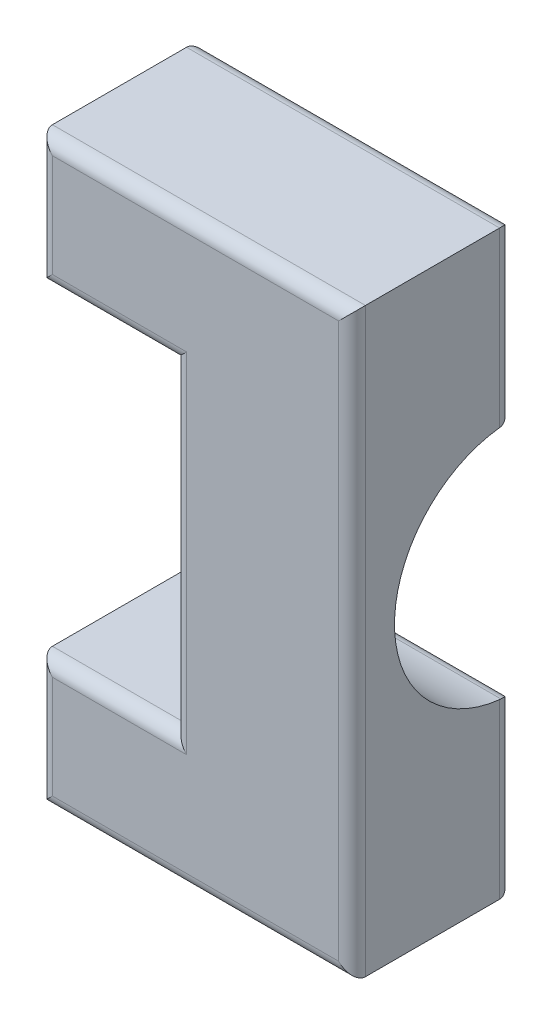
ISO-10303-21;
HEADER;
FILE_DESCRIPTION(('STEP AP214'),'2;1');
FILE_NAME('part.step','',(''),(''),'','','');
FILE_SCHEMA(('AUTOMOTIVE_DESIGN { 1 0 10303 214 1 1 1 1 }'));
ENDSEC;
DATA;
#1=APPLICATION_CONTEXT('core data for automotive mechanical design processes');
#2=APPLICATION_PROTOCOL_DEFINITION('international standard','automotive_design',2000,#1);
#3=PRODUCT_CONTEXT('',#1,'mechanical');
#4=PRODUCT('Part','Part','',(#3));
#5=PRODUCT_RELATED_PRODUCT_CATEGORY('part','',(#4));
#6=PRODUCT_DEFINITION_FORMATION('','',#4);
#7=PRODUCT_DEFINITION_CONTEXT('part definition',#1,'design');
#8=PRODUCT_DEFINITION('design','',#6,#7);
#9=PRODUCT_DEFINITION_SHAPE('','',#8);
#10=(LENGTH_UNIT() NAMED_UNIT(*) SI_UNIT(.MILLI.,.METRE.));
#11=(NAMED_UNIT(*) PLANE_ANGLE_UNIT() SI_UNIT($,.RADIAN.));
#12=(NAMED_UNIT(*) SI_UNIT($,.STERADIAN.) SOLID_ANGLE_UNIT());
#13=UNCERTAINTY_MEASURE_WITH_UNIT(LENGTH_MEASURE(1.E-05),#10,'distance_accuracy_value','');
#14=(GEOMETRIC_REPRESENTATION_CONTEXT(3) GLOBAL_UNCERTAINTY_ASSIGNED_CONTEXT((#13)) GLOBAL_UNIT_ASSIGNED_CONTEXT((#10,
#11,#12)) REPRESENTATION_CONTEXT('',''));
#15=CARTESIAN_POINT('',(0.,0.,0.));
#16=DIRECTION('',(0.,0.,1.));
#17=DIRECTION('',(1.,0.,0.));
#18=AXIS2_PLACEMENT_3D('',#15,#16,#17);
#19=CARTESIAN_POINT('',(0.,0.,0.));
#20=DIRECTION('',(0.,0.,1.));
#21=DIRECTION('',(1.,0.,0.));
#22=AXIS2_PLACEMENT_3D('',#19,#20,#21);
#23=PLANE('',#22);
#24=DIRECTION('',(0.,1.,0.));
#25=VECTOR('',#24,1.);
#26=CARTESIAN_POINT('',(1.5,65.,0.));
#27=LINE('',#26,#25);
#28=CARTESIAN_POINT('',(1.5,52.,0.));
#29=VERTEX_POINT('',#28);
#30=CARTESIAN_POINT('',(1.5,63.5,0.));
#31=VERTEX_POINT('',#30);
#32=EDGE_CURVE('E208',#29,#31,#27,.T.);
#33=ORIENTED_EDGE('',*,*,#32,.T.);
#34=DIRECTION('',(1.,0.,0.));
#35=VECTOR('',#34,1.);
#36=CARTESIAN_POINT('',(35.,63.5,0.));
#37=LINE('',#36,#35);
#38=CARTESIAN_POINT('',(33.5,63.5,0.));
#39=VERTEX_POINT('',#38);
#40=EDGE_CURVE('E189',#31,#39,#37,.T.);
#41=ORIENTED_EDGE('',*,*,#40,.T.);
#42=DIRECTION('',(0.,-1.,0.));
#43=VECTOR('',#42,1.);
#44=CARTESIAN_POINT('',(33.5,45.75,0.));
#45=LINE('',#44,#43);
#46=CARTESIAN_POINT('',(33.5,47.1735305908292,0.));
#47=VERTEX_POINT('',#46);
#48=EDGE_CURVE('E197',#39,#47,#45,.T.);
#49=ORIENTED_EDGE('',*,*,#48,.T.);
#50=DIRECTION('',(-1.,0.,0.));
#51=VECTOR('',#50,1.);
#52=CARTESIAN_POINT('',(0.,47.1735305908292,0.));
#53=LINE('',#52,#51);
#54=CARTESIAN_POINT('',(16.5,47.1735305908292,0.));
#55=VERTEX_POINT('',#54);
#56=EDGE_CURVE('E204',#47,#55,#53,.T.);
#57=ORIENTED_EDGE('',*,*,#56,.T.);
#58=DIRECTION('',(0.,1.,0.));
#59=VECTOR('',#58,1.);
#60=CARTESIAN_POINT('',(16.5,50.5,0.));
#61=LINE('',#60,#59);
#62=CARTESIAN_POINT('',(16.5,52.,0.));
#63=VERTEX_POINT('',#62);
#64=EDGE_CURVE('E463',#55,#63,#61,.T.);
#65=ORIENTED_EDGE('',*,*,#64,.T.);
#66=DIRECTION('',(1.,0.,0.));
#67=VECTOR('',#66,1.);
#68=CARTESIAN_POINT('',(0.,52.,0.));
#69=LINE('',#68,#67);
#70=EDGE_CURVE('E213',#63,#29,#69,.F.);
#71=ORIENTED_EDGE('',*,*,#70,.T.);
#72=EDGE_LOOP('',(#33,#41,#49,#57,#65,#71));
#73=FACE_BOUND('',#72,.T.);
#74=ADVANCED_FACE('F35',(#73),#23,.F.);
#75=CARTESIAN_POINT('',(15.,0.,18.));
#76=DIRECTION('',(-1.,0.,0.));
#77=DIRECTION('',(0.,0.,1.));
#78=AXIS2_PLACEMENT_3D('',#75,#76,#77);
#79=PLANE('',#78);
#80=DIRECTION('',(0.,0.,-1.));
#81=VECTOR('',#80,1.);
#82=CARTESIAN_POINT('',(15.,14.5,18.));
#83=LINE('',#82,#81);
#84=CARTESIAN_POINT('',(15.,14.5,16.5));
#85=VERTEX_POINT('',#84);
#86=CARTESIAN_POINT('',(15.,14.5,1.5));
#87=VERTEX_POINT('',#86);
#88=EDGE_CURVE('E205',#85,#87,#83,.T.);
#89=ORIENTED_EDGE('',*,*,#88,.F.);
#90=DIRECTION('',(0.,1.,0.));
#91=VECTOR('',#90,1.);
#92=CARTESIAN_POINT('',(15.,0.,16.5));
#93=LINE('',#92,#91);
#94=CARTESIAN_POINT('',(15.,50.5,16.5));
#95=VERTEX_POINT('',#94);
#96=EDGE_CURVE('E233',#85,#95,#93,.T.);
#97=ORIENTED_EDGE('',*,*,#96,.T.);
#98=DIRECTION('',(0.,0.,-1.));
#99=VECTOR('',#98,1.);
#100=CARTESIAN_POINT('',(15.,50.5,18.));
#101=LINE('',#100,#99);
#102=CARTESIAN_POINT('',(15.,50.5,1.5));
#103=VERTEX_POINT('',#102);
#104=EDGE_CURVE('E485',#95,#103,#101,.T.);
#105=ORIENTED_EDGE('',*,*,#104,.T.);
#106=DIRECTION('',(0.,1.,0.));
#107=VECTOR('',#106,1.);
#108=CARTESIAN_POINT('',(15.,45.75,1.5));
#109=LINE('',#108,#107);
#110=CARTESIAN_POINT('',(15.,47.1735305908292,1.5));
#111=VERTEX_POINT('',#110);
#112=EDGE_CURVE('E231',#103,#111,#109,.F.);
#113=ORIENTED_EDGE('',*,*,#112,.T.);
#114=CARTESIAN_POINT('',(15.,32.5,0.));
#115=DIRECTION('',(-1.,0.,0.));
#116=DIRECTION('',(0.,0.,1.));
#117=AXIS2_PLACEMENT_3D('',#114,#115,#116);
#118=CIRCLE('',#117,14.75);
#119=CARTESIAN_POINT('',(15.,17.8264694091708,1.5));
#120=VERTEX_POINT('',#119);
#121=EDGE_CURVE('E227',#111,#120,#118,.F.);
#122=ORIENTED_EDGE('',*,*,#121,.T.);
#123=DIRECTION('',(0.,1.,0.));
#124=VECTOR('',#123,1.);
#125=CARTESIAN_POINT('',(15.,14.5,1.5));
#126=LINE('',#125,#124);
#127=EDGE_CURVE('E229',#120,#87,#126,.F.);
#128=ORIENTED_EDGE('',*,*,#127,.T.);
#129=EDGE_LOOP('',(#89,#97,#105,#113,#122,#128));
#130=FACE_BOUND('',#129,.T.);
#131=ADVANCED_FACE('F318',(#130),#79,.T.);
#132=CARTESIAN_POINT('',(0.,14.5,18.));
#133=DIRECTION('',(0.,-1.,0.));
#134=DIRECTION('',(1.,0.,0.));
#135=AXIS2_PLACEMENT_3D('',#132,#133,#134);
#136=PLANE('',#135);
#137=ORIENTED_EDGE('',*,*,#88,.T.);
#138=DIRECTION('',(-1.,0.,0.));
#139=VECTOR('',#138,1.);
#140=CARTESIAN_POINT('',(0.,14.5,1.5));
#141=LINE('',#140,#139);
#142=CARTESIAN_POINT('',(0.,14.5,1.5));
#143=VERTEX_POINT('',#142);
#144=EDGE_CURVE('E500',#87,#143,#141,.T.);
#145=ORIENTED_EDGE('',*,*,#144,.T.);
#146=DIRECTION('',(0.,0.,-1.));
#147=VECTOR('',#146,1.);
#148=CARTESIAN_POINT('',(0.,14.5,18.));
#149=LINE('',#148,#147);
#150=CARTESIAN_POINT('',(0.,14.5,16.5));
#151=VERTEX_POINT('',#150);
#152=EDGE_CURVE('E453',#151,#143,#149,.T.);
#153=ORIENTED_EDGE('',*,*,#152,.F.);
#154=DIRECTION('',(-1.,0.,0.));
#155=VECTOR('',#154,1.);
#156=CARTESIAN_POINT('',(15.,14.5,16.5));
#157=LINE('',#156,#155);
#158=EDGE_CURVE('E498',#151,#85,#157,.F.);
#159=ORIENTED_EDGE('',*,*,#158,.T.);
#160=EDGE_LOOP('',(#137,#145,#153,#159));
#161=FACE_BOUND('',#160,.T.);
#162=ADVANCED_FACE('F322',(#161),#136,.F.);
#163=CARTESIAN_POINT('',(0.,0.,18.));
#164=DIRECTION('',(-1.,0.,0.));
#165=DIRECTION('',(0.,0.,1.));
#166=AXIS2_PLACEMENT_3D('',#163,#164,#165);
#167=PLANE('',#166);
#168=ORIENTED_EDGE('',*,*,#152,.T.);
#169=DIRECTION('',(0.,1.,0.));
#170=VECTOR('',#169,1.);
#171=CARTESIAN_POINT('',(0.,0.,1.5));
#172=LINE('',#171,#170);
#173=CARTESIAN_POINT('',(0.,0.,1.5));
#174=VERTEX_POINT('',#173);
#175=EDGE_CURVE('E346',#143,#174,#172,.F.);
#176=ORIENTED_EDGE('',*,*,#175,.T.);
#177=DIRECTION('',(0.,0.,-1.));
#178=VECTOR('',#177,1.);
#179=CARTESIAN_POINT('',(0.,0.,18.));
#180=LINE('',#179,#178);
#181=CARTESIAN_POINT('',(0.,0.,16.5));
#182=VERTEX_POINT('',#181);
#183=EDGE_CURVE('E446',#182,#174,#180,.T.);
#184=ORIENTED_EDGE('',*,*,#183,.F.);
#185=DIRECTION('',(0.,1.,0.));
#186=VECTOR('',#185,1.);
#187=CARTESIAN_POINT('',(0.,0.,16.5));
#188=LINE('',#187,#186);
#189=EDGE_CURVE('E354',#182,#151,#188,.T.);
#190=ORIENTED_EDGE('',*,*,#189,.T.);
#191=EDGE_LOOP('',(#168,#176,#184,#190));
#192=FACE_BOUND('',#191,.T.);
#193=ADVANCED_FACE('F451',(#192),#167,.T.);
#194=CARTESIAN_POINT('',(0.,0.,18.));
#195=DIRECTION('',(0.,-1.,0.));
#196=DIRECTION('',(0.,0.,-1.));
#197=AXIS2_PLACEMENT_3D('',#194,#195,#196);
#198=PLANE('',#197);
#199=ORIENTED_EDGE('',*,*,#183,.T.);
#200=DIRECTION('',(-1.,0.,0.));
#201=VECTOR('',#200,1.);
#202=CARTESIAN_POINT('',(35.,0.,1.5));
#203=LINE('',#202,#201);
#204=CARTESIAN_POINT('',(35.,0.,1.5));
#205=VERTEX_POINT('',#204);
#206=EDGE_CURVE('E362',#174,#205,#203,.F.);
#207=ORIENTED_EDGE('',*,*,#206,.T.);
#208=DIRECTION('',(0.,0.,-1.));
#209=VECTOR('',#208,1.);
#210=CARTESIAN_POINT('',(35.,0.,18.));
#211=LINE('',#210,#209);
#212=CARTESIAN_POINT('',(35.,0.,16.5));
#213=VERTEX_POINT('',#212);
#214=EDGE_CURVE('E448',#213,#205,#211,.T.);
#215=ORIENTED_EDGE('',*,*,#214,.F.);
#216=DIRECTION('',(-1.,0.,0.));
#217=VECTOR('',#216,1.);
#218=CARTESIAN_POINT('',(0.,0.,16.5));
#219=LINE('',#218,#217);
#220=EDGE_CURVE('E360',#213,#182,#219,.T.);
#221=ORIENTED_EDGE('',*,*,#220,.T.);
#222=EDGE_LOOP('',(#199,#207,#215,#221));
#223=FACE_BOUND('',#222,.T.);
#224=ADVANCED_FACE('F445',(#223),#198,.T.);
#225=CARTESIAN_POINT('',(35.,0.,18.));
#226=DIRECTION('',(1.,0.,0.));
#227=DIRECTION('',(0.,0.,-1.));
#228=AXIS2_PLACEMENT_3D('',#225,#226,#227);
#229=PLANE('',#228);
#230=CARTESIAN_POINT('',(35.,32.5,0.));
#231=DIRECTION('',(-1.,0.,0.));
#232=DIRECTION('',(0.,0.,1.));
#233=AXIS2_PLACEMENT_3D('',#230,#231,#232);
#234=CIRCLE('',#233,13.25);
#235=CARTESIAN_POINT('',(35.,19.3351794543184,1.5));
#236=VERTEX_POINT('',#235);
#237=CARTESIAN_POINT('',(35.,45.6648205456816,1.5));
#238=VERTEX_POINT('',#237);
#239=EDGE_CURVE('E409',#236,#238,#234,.T.);
#240=ORIENTED_EDGE('',*,*,#239,.T.);
#241=DIRECTION('',(0.,-1.,0.));
#242=VECTOR('',#241,1.);
#243=CARTESIAN_POINT('',(35.,65.,1.5));
#244=LINE('',#243,#242);
#245=CARTESIAN_POINT('',(35.,65.,1.5));
#246=VERTEX_POINT('',#245);
#247=EDGE_CURVE('E494',#238,#246,#244,.F.);
#248=ORIENTED_EDGE('',*,*,#247,.T.);
#249=DIRECTION('',(0.,0.,-1.));
#250=VECTOR('',#249,1.);
#251=CARTESIAN_POINT('',(35.,65.,18.));
#252=LINE('',#251,#250);
#253=CARTESIAN_POINT('',(35.,65.,16.5));
#254=VERTEX_POINT('',#253);
#255=EDGE_CURVE('E456',#254,#246,#252,.T.);
#256=ORIENTED_EDGE('',*,*,#255,.F.);
#257=DIRECTION('',(0.,-1.,0.));
#258=VECTOR('',#257,1.);
#259=CARTESIAN_POINT('',(35.,0.,16.5));
#260=LINE('',#259,#258);
#261=EDGE_CURVE('E270',#254,#213,#260,.T.);
#262=ORIENTED_EDGE('',*,*,#261,.T.);
#263=ORIENTED_EDGE('',*,*,#214,.T.);
#264=DIRECTION('',(0.,-1.,0.));
#265=VECTOR('',#264,1.);
#266=CARTESIAN_POINT('',(35.,19.25,1.5));
#267=LINE('',#266,#265);
#268=EDGE_CURVE('E496',#205,#236,#267,.F.);
#269=ORIENTED_EDGE('',*,*,#268,.T.);
#270=EDGE_LOOP('',(#240,#248,#256,#262,#263,#269));
#271=FACE_BOUND('',#270,.T.);
#272=ADVANCED_FACE('F493',(#271),#229,.T.);
#273=CARTESIAN_POINT('',(0.,65.,18.));
#274=DIRECTION('',(0.,1.,0.));
#275=DIRECTION('',(0.,0.,1.));
#276=AXIS2_PLACEMENT_3D('',#273,#274,#275);
#277=PLANE('',#276);
#278=ORIENTED_EDGE('',*,*,#255,.T.);
#279=DIRECTION('',(1.,0.,0.));
#280=VECTOR('',#279,1.);
#281=CARTESIAN_POINT('',(0.,65.,1.5));
#282=LINE('',#281,#280);
#283=CARTESIAN_POINT('',(0.,65.,1.5));
#284=VERTEX_POINT('',#283);
#285=EDGE_CURVE('E191',#246,#284,#282,.F.);
#286=ORIENTED_EDGE('',*,*,#285,.T.);
#287=DIRECTION('',(0.,0.,-1.));
#288=VECTOR('',#287,1.);
#289=CARTESIAN_POINT('',(0.,65.,18.));
#290=LINE('',#289,#288);
#291=CARTESIAN_POINT('',(0.,65.,16.5));
#292=VERTEX_POINT('',#291);
#293=EDGE_CURVE('E478',#292,#284,#290,.T.);
#294=ORIENTED_EDGE('',*,*,#293,.F.);
#295=DIRECTION('',(1.,0.,0.));
#296=VECTOR('',#295,1.);
#297=CARTESIAN_POINT('',(0.,65.,16.5));
#298=LINE('',#297,#296);
#299=EDGE_CURVE('E210',#292,#254,#298,.T.);
#300=ORIENTED_EDGE('',*,*,#299,.T.);
#301=EDGE_LOOP('',(#278,#286,#294,#300));
#302=FACE_BOUND('',#301,.T.);
#303=ADVANCED_FACE('F477',(#302),#277,.T.);
#304=CARTESIAN_POINT('',(0.,0.,18.));
#305=DIRECTION('',(-1.,0.,0.));
#306=DIRECTION('',(0.,0.,1.));
#307=AXIS2_PLACEMENT_3D('',#304,#305,#306);
#308=PLANE('',#307);
#309=ORIENTED_EDGE('',*,*,#293,.T.);
#310=DIRECTION('',(0.,1.,0.));
#311=VECTOR('',#310,1.);
#312=CARTESIAN_POINT('',(0.,50.5,1.5));
#313=LINE('',#312,#311);
#314=CARTESIAN_POINT('',(0.,50.5,1.5));
#315=VERTEX_POINT('',#314);
#316=EDGE_CURVE('E220',#284,#315,#313,.F.);
#317=ORIENTED_EDGE('',*,*,#316,.T.);
#318=DIRECTION('',(0.,0.,-1.));
#319=VECTOR('',#318,1.);
#320=CARTESIAN_POINT('',(0.,50.5,18.));
#321=LINE('',#320,#319);
#322=CARTESIAN_POINT('',(0.,50.5,16.5));
#323=VERTEX_POINT('',#322);
#324=EDGE_CURVE('E483',#323,#315,#321,.T.);
#325=ORIENTED_EDGE('',*,*,#324,.F.);
#326=DIRECTION('',(0.,1.,0.));
#327=VECTOR('',#326,1.);
#328=CARTESIAN_POINT('',(0.,0.,16.5));
#329=LINE('',#328,#327);
#330=EDGE_CURVE('E218',#323,#292,#329,.T.);
#331=ORIENTED_EDGE('',*,*,#330,.T.);
#332=EDGE_LOOP('',(#309,#317,#325,#331));
#333=FACE_BOUND('',#332,.T.);
#334=ADVANCED_FACE('F481',(#333),#308,.T.);
#335=CARTESIAN_POINT('',(0.,50.5,18.));
#336=DIRECTION('',(0.,1.,0.));
#337=DIRECTION('',(0.,0.,1.));
#338=AXIS2_PLACEMENT_3D('',#335,#336,#337);
#339=PLANE('',#338);
#340=ORIENTED_EDGE('',*,*,#324,.T.);
#341=DIRECTION('',(1.,0.,0.));
#342=VECTOR('',#341,1.);
#343=CARTESIAN_POINT('',(0.,50.5,1.5));
#344=LINE('',#343,#342);
#345=EDGE_CURVE('E225',#315,#103,#344,.T.);
#346=ORIENTED_EDGE('',*,*,#345,.T.);
#347=ORIENTED_EDGE('',*,*,#104,.F.);
#348=DIRECTION('',(1.,0.,0.));
#349=VECTOR('',#348,1.);
#350=CARTESIAN_POINT('',(0.,50.5,16.5));
#351=LINE('',#350,#349);
#352=EDGE_CURVE('E222',#95,#323,#351,.F.);
#353=ORIENTED_EDGE('',*,*,#352,.T.);
#354=EDGE_LOOP('',(#340,#346,#347,#353));
#355=FACE_BOUND('',#354,.T.);
#356=ADVANCED_FACE('F330',(#355),#339,.F.);
#357=CARTESIAN_POINT('',(0.,0.,18.));
#358=DIRECTION('',(0.,0.,1.));
#359=DIRECTION('',(1.,0.,0.));
#360=AXIS2_PLACEMENT_3D('',#357,#358,#359);
#361=PLANE('',#360);
#362=DIRECTION('',(0.,1.,0.));
#363=VECTOR('',#362,1.);
#364=CARTESIAN_POINT('',(1.5,0.,18.));
#365=LINE('',#364,#363);
#366=CARTESIAN_POINT('',(1.5,63.5,18.));
#367=VERTEX_POINT('',#366);
#368=CARTESIAN_POINT('',(1.5,52.,18.));
#369=VERTEX_POINT('',#368);
#370=EDGE_CURVE('E44',#367,#369,#365,.F.);
#371=ORIENTED_EDGE('',*,*,#370,.T.);
#372=DIRECTION('',(1.,0.,0.));
#373=VECTOR('',#372,1.);
#374=CARTESIAN_POINT('',(15.,52.,18.));
#375=LINE('',#374,#373);
#376=CARTESIAN_POINT('',(16.5,52.,18.));
#377=VERTEX_POINT('',#376);
#378=EDGE_CURVE('E11',#369,#377,#375,.T.);
#379=ORIENTED_EDGE('',*,*,#378,.T.);
#380=DIRECTION('',(0.,1.,0.));
#381=VECTOR('',#380,1.);
#382=CARTESIAN_POINT('',(16.5,0.,18.));
#383=LINE('',#382,#381);
#384=CARTESIAN_POINT('',(16.5,13.,18.));
#385=VERTEX_POINT('',#384);
#386=EDGE_CURVE('E364',#377,#385,#383,.F.);
#387=ORIENTED_EDGE('',*,*,#386,.T.);
#388=DIRECTION('',(-1.,0.,0.));
#389=VECTOR('',#388,1.);
#390=CARTESIAN_POINT('',(0.,13.,18.));
#391=LINE('',#390,#389);
#392=CARTESIAN_POINT('',(1.5,13.,18.));
#393=VERTEX_POINT('',#392);
#394=EDGE_CURVE('E366',#385,#393,#391,.T.);
#395=ORIENTED_EDGE('',*,*,#394,.T.);
#396=DIRECTION('',(0.,1.,0.));
#397=VECTOR('',#396,1.);
#398=CARTESIAN_POINT('',(1.5,0.,18.));
#399=LINE('',#398,#397);
#400=CARTESIAN_POINT('',(1.5,1.5,18.));
#401=VERTEX_POINT('',#400);
#402=EDGE_CURVE('E368',#393,#401,#399,.F.);
#403=ORIENTED_EDGE('',*,*,#402,.T.);
#404=DIRECTION('',(-1.,0.,0.));
#405=VECTOR('',#404,1.);
#406=CARTESIAN_POINT('',(0.,1.5,18.));
#407=LINE('',#406,#405);
#408=CARTESIAN_POINT('',(33.5,1.5,18.));
#409=VERTEX_POINT('',#408);
#410=EDGE_CURVE('E370',#401,#409,#407,.F.);
#411=ORIENTED_EDGE('',*,*,#410,.T.);
#412=DIRECTION('',(0.,-1.,0.));
#413=VECTOR('',#412,1.);
#414=CARTESIAN_POINT('',(33.5,0.,18.));
#415=LINE('',#414,#413);
#416=CARTESIAN_POINT('',(33.5,63.5,18.));
#417=VERTEX_POINT('',#416);
#418=EDGE_CURVE('E372',#409,#417,#415,.F.);
#419=ORIENTED_EDGE('',*,*,#418,.T.);
#420=DIRECTION('',(1.,0.,0.));
#421=VECTOR('',#420,1.);
#422=CARTESIAN_POINT('',(0.,63.5,18.));
#423=LINE('',#422,#421);
#424=EDGE_CURVE('E55',#417,#367,#423,.F.);
#425=ORIENTED_EDGE('',*,*,#424,.T.);
#426=EDGE_LOOP('',(#371,#379,#387,#395,#403,#411,#419,#425));
#427=FACE_BOUND('',#426,.T.);
#428=ADVANCED_FACE('F260',(#427),#361,.T.);
#429=DIRECTION('',(0.,1.,0.));
#430=VECTOR('',#429,1.);
#431=CARTESIAN_POINT('',(1.5,14.5,0.));
#432=LINE('',#431,#430);
#433=CARTESIAN_POINT('',(1.5,1.5,0.));
#434=VERTEX_POINT('',#433);
#435=CARTESIAN_POINT('',(1.5,13.,0.));
#436=VERTEX_POINT('',#435);
#437=EDGE_CURVE('E333',#434,#436,#432,.T.);
#438=ORIENTED_EDGE('',*,*,#437,.T.);
#439=DIRECTION('',(-1.,0.,0.));
#440=VECTOR('',#439,1.);
#441=CARTESIAN_POINT('',(0.,13.,0.));
#442=LINE('',#441,#440);
#443=CARTESIAN_POINT('',(16.5,13.,0.));
#444=VERTEX_POINT('',#443);
#445=EDGE_CURVE('E336',#436,#444,#442,.F.);
#446=ORIENTED_EDGE('',*,*,#445,.T.);
#447=DIRECTION('',(0.,1.,0.));
#448=VECTOR('',#447,1.);
#449=CARTESIAN_POINT('',(16.5,19.25,0.));
#450=LINE('',#449,#448);
#451=CARTESIAN_POINT('',(16.5,17.8264694091708,0.));
#452=VERTEX_POINT('',#451);
#453=EDGE_CURVE('E504',#444,#452,#450,.T.);
#454=ORIENTED_EDGE('',*,*,#453,.T.);
#455=DIRECTION('',(-1.,0.,0.));
#456=VECTOR('',#455,1.);
#457=CARTESIAN_POINT('',(0.,17.8264694091708,0.));
#458=LINE('',#457,#456);
#459=CARTESIAN_POINT('',(33.5,17.8264694091708,0.));
#460=VERTEX_POINT('',#459);
#461=EDGE_CURVE('E506',#452,#460,#458,.F.);
#462=ORIENTED_EDGE('',*,*,#461,.T.);
#463=DIRECTION('',(0.,-1.,0.));
#464=VECTOR('',#463,1.);
#465=CARTESIAN_POINT('',(33.5,0.,0.));
#466=LINE('',#465,#464);
#467=CARTESIAN_POINT('',(33.5,1.5,0.));
#468=VERTEX_POINT('',#467);
#469=EDGE_CURVE('E508',#460,#468,#466,.T.);
#470=ORIENTED_EDGE('',*,*,#469,.T.);
#471=DIRECTION('',(-1.,0.,0.));
#472=VECTOR('',#471,1.);
#473=CARTESIAN_POINT('',(0.,1.5,0.));
#474=LINE('',#473,#472);
#475=EDGE_CURVE('E338',#468,#434,#474,.T.);
#476=ORIENTED_EDGE('',*,*,#475,.T.);
#477=EDGE_LOOP('',(#438,#446,#454,#462,#470,#476));
#478=FACE_BOUND('',#477,.T.);
#479=ADVANCED_FACE('F258',(#478),#23,.F.);
#480=CARTESIAN_POINT('',(35.,32.5,0.));
#481=DIRECTION('',(-1.,0.,0.));
#482=DIRECTION('',(0.,0.,1.));
#483=AXIS2_PLACEMENT_3D('',#480,#481,#482);
#484=CYLINDRICAL_SURFACE('',#483,13.25);
#485=DIRECTION('',(-1.,0.,0.));
#486=VECTOR('',#485,1.);
#487=CARTESIAN_POINT('',(35.,45.6813071409144,1.34745762711864));
#488=LINE('',#487,#486);
#489=CARTESIAN_POINT('',(16.5,45.6813071409144,1.34745762711864));
#490=VERTEX_POINT('',#489);
#491=CARTESIAN_POINT('',(34.9922234499148,45.6813071409144,1.34745762711864));
#492=VERTEX_POINT('',#491);
#493=EDGE_CURVE('E247',#490,#492,#488,.F.);
#494=ORIENTED_EDGE('',*,*,#493,.T.);
#495=CARTESIAN_POINT('',(34.9922234499148,45.6813071409144,1.34745762711864));
#496=CARTESIAN_POINT('',(34.9948156399963,45.678713634359,1.37283195350671));
#497=CARTESIAN_POINT('',(34.9967597808775,45.6760429981452,1.39823098110752));
#498=CARTESIAN_POINT('',(34.9993519642392,45.670547466401,1.44907843873464));
#499=CARTESIAN_POINT('',(35.0000000067198,45.6677225708705,1.47452686876094));
#500=CARTESIAN_POINT('',(35.,45.6648205456816,1.5));
#501=B_SPLINE_CURVE_WITH_KNOTS('',3,(#495,#496,#497,#498,#499,#500),.UNSPECIFIED.,.F.,.F.,(4,2,
4),(0.,0.0768388135096377,0.153677627019276),.UNSPECIFIED.);
#502=EDGE_CURVE('E263',#492,#238,#501,.T.);
#503=ORIENTED_EDGE('',*,*,#502,.T.);
#504=ORIENTED_EDGE('',*,*,#239,.F.);
#505=CARTESIAN_POINT('',(35.,19.3351794543184,1.5));
#506=CARTESIAN_POINT('',(35.0000000067198,19.3322774291295,1.47452686876094));
#507=CARTESIAN_POINT('',(34.9993519642392,19.329452533599,1.44907843873463));
#508=CARTESIAN_POINT('',(34.9967597808775,19.3239570018548,1.39823098110752));
#509=CARTESIAN_POINT('',(34.9948156399963,19.321286365641,1.37283195350671));
#510=CARTESIAN_POINT('',(34.9922234499148,19.3186928590856,1.34745762711864));
#511=B_SPLINE_CURVE_WITH_KNOTS('',3,(#505,#506,#507,#508,#509,#510),.UNSPECIFIED.,.F.,.F.,(4,2,
4),(0.,0.0768388135096384,0.153677627019277),.UNSPECIFIED.);
#512=CARTESIAN_POINT('',(34.9922234499148,19.3186928590856,1.34745762711864));
#513=VERTEX_POINT('',#512);
#514=EDGE_CURVE('E239',#236,#513,#511,.T.);
#515=ORIENTED_EDGE('',*,*,#514,.T.);
#516=DIRECTION('',(-1.,0.,0.));
#517=VECTOR('',#516,1.);
#518=CARTESIAN_POINT('',(35.,19.3186928590856,1.34745762711864));
#519=LINE('',#518,#517);
#520=CARTESIAN_POINT('',(16.5,19.3186928590856,1.34745762711864));
#521=VERTEX_POINT('',#520);
#522=EDGE_CURVE('E237',#513,#521,#519,.T.);
#523=ORIENTED_EDGE('',*,*,#522,.T.);
#524=CARTESIAN_POINT('',(16.5,32.5,0.));
#525=DIRECTION('',(-1.,0.,0.));
#526=DIRECTION('',(0.,0.,1.));
#527=AXIS2_PLACEMENT_3D('',#524,#525,#526);
#528=CIRCLE('',#527,13.25);
#529=EDGE_CURVE('E235',#521,#490,#528,.T.);
#530=ORIENTED_EDGE('',*,*,#529,.T.);
#531=EDGE_LOOP('',(#494,#503,#504,#515,#523,#530));
#532=FACE_BOUND('',#531,.T.);
#533=ADVANCED_FACE('F253',(#532),#484,.F.);
#534=CARTESIAN_POINT('',(1.5,0.,1.5));
#535=DIRECTION('',(0.,-1.,0.));
#536=DIRECTION('',(0.,0.,-1.));
#537=AXIS2_PLACEMENT_3D('',#534,#535,#536);
#538=CYLINDRICAL_SURFACE('',#537,1.5);
#539=CARTESIAN_POINT('',(1.5,13.,1.5));
#540=DIRECTION('',(-0.707106781186547,-0.707106781186548,0.));
#541=DIRECTION('',(0.707106781186548,-0.707106781186547,0.));
#542=AXIS2_PLACEMENT_3D('',#539,#540,#541);
#543=ELLIPSE('',#542,2.12132034355964,1.5);
#544=EDGE_CURVE('E345',#436,#143,#543,.F.);
#545=ORIENTED_EDGE('',*,*,#544,.F.);
#546=ORIENTED_EDGE('',*,*,#437,.F.);
#547=CARTESIAN_POINT('',(1.5,1.5,1.5));
#548=DIRECTION('',(0.707106781186547,-0.707106781186547,0.));
#549=DIRECTION('',(0.707106781186547,0.707106781186547,0.));
#550=AXIS2_PLACEMENT_3D('',#547,#548,#549);
#551=ELLIPSE('',#550,2.12132034355964,1.5);
#552=EDGE_CURVE('E349',#174,#434,#551,.T.);
#553=ORIENTED_EDGE('',*,*,#552,.F.);
#554=ORIENTED_EDGE('',*,*,#175,.F.);
#555=EDGE_LOOP('',(#545,#546,#553,#554));
#556=FACE_BOUND('',#555,.T.);
#557=ADVANCED_FACE('F257',(#556),#538,.T.);
#558=CARTESIAN_POINT('',(0.,1.5,1.5));
#559=DIRECTION('',(1.,0.,0.));
#560=DIRECTION('',(0.,0.,-1.));
#561=AXIS2_PLACEMENT_3D('',#558,#559,#560);
#562=CYLINDRICAL_SURFACE('',#561,1.5);
#563=ORIENTED_EDGE('',*,*,#552,.T.);
#564=ORIENTED_EDGE('',*,*,#475,.F.);
#565=CARTESIAN_POINT('',(33.5,1.5,1.5));
#566=DIRECTION('',(0.707106781186547,0.707106781186547,0.));
#567=DIRECTION('',(-0.707106781186547,0.707106781186547,0.));
#568=AXIS2_PLACEMENT_3D('',#565,#566,#567);
#569=ELLIPSE('',#568,2.12132034355964,1.5);
#570=EDGE_CURVE('E350',#205,#468,#569,.T.);
#571=ORIENTED_EDGE('',*,*,#570,.F.);
#572=ORIENTED_EDGE('',*,*,#206,.F.);
#573=EDGE_LOOP('',(#563,#564,#571,#572));
#574=FACE_BOUND('',#573,.T.);
#575=ADVANCED_FACE('F514',(#574),#562,.T.);
#576=CARTESIAN_POINT('',(0.,13.,1.5));
#577=DIRECTION('',(-1.,0.,0.));
#578=DIRECTION('',(0.,-1.,0.));
#579=AXIS2_PLACEMENT_3D('',#576,#577,#578);
#580=CYLINDRICAL_SURFACE('',#579,1.5);
#581=ORIENTED_EDGE('',*,*,#544,.T.);
#582=ORIENTED_EDGE('',*,*,#144,.F.);
#583=CARTESIAN_POINT('',(16.5,13.,1.5));
#584=DIRECTION('',(-0.707106781186547,-0.707106781186548,0.));
#585=DIRECTION('',(-0.707106781186548,0.707106781186547,0.));
#586=AXIS2_PLACEMENT_3D('',#583,#584,#585);
#587=ELLIPSE('',#586,2.12132034355964,1.5);
#588=EDGE_CURVE('E353',#444,#87,#587,.F.);
#589=ORIENTED_EDGE('',*,*,#588,.F.);
#590=ORIENTED_EDGE('',*,*,#445,.F.);
#591=EDGE_LOOP('',(#581,#582,#589,#590));
#592=FACE_BOUND('',#591,.T.);
#593=ADVANCED_FACE('F314',(#592),#580,.T.);
#594=CARTESIAN_POINT('',(33.5,0.,1.5));
#595=DIRECTION('',(0.,1.,0.));
#596=DIRECTION('',(0.,0.,1.));
#597=AXIS2_PLACEMENT_3D('',#594,#595,#596);
#598=CYLINDRICAL_SURFACE('',#597,1.5);
#599=ORIENTED_EDGE('',*,*,#570,.T.);
#600=ORIENTED_EDGE('',*,*,#469,.F.);
#601=CARTESIAN_POINT('',(33.5,17.8264694091708,1.5));
#602=DIRECTION('',(-0.707106781186547,0.707106781186547,0.));
#603=DIRECTION('',(-0.707106781186547,-0.707106781186547,0.));
#604=AXIS2_PLACEMENT_3D('',#601,#602,#603);
#605=ELLIPSE('',#604,2.12132034355964,1.5);
#606=EDGE_CURVE('E402',#513,#460,#605,.T.);
#607=ORIENTED_EDGE('',*,*,#606,.F.);
#608=ORIENTED_EDGE('',*,*,#514,.F.);
#609=ORIENTED_EDGE('',*,*,#268,.F.);
#610=EDGE_LOOP('',(#599,#600,#607,#608,#609));
#611=FACE_BOUND('',#610,.T.);
#612=ADVANCED_FACE('F249',(#611),#598,.T.);
#613=CARTESIAN_POINT('',(16.5,0.,1.5));
#614=DIRECTION('',(0.,-1.,0.));
#615=DIRECTION('',(0.,0.,-1.));
#616=AXIS2_PLACEMENT_3D('',#613,#614,#615);
#617=CYLINDRICAL_SURFACE('',#616,1.5);
#618=ORIENTED_EDGE('',*,*,#588,.T.);
#619=ORIENTED_EDGE('',*,*,#127,.F.);
#620=CARTESIAN_POINT('',(16.5,17.8264694091708,1.5));
#621=DIRECTION('',(0.,1.,0.));
#622=DIRECTION('',(0.,0.,1.));
#623=AXIS2_PLACEMENT_3D('',#620,#621,#622);
#624=CIRCLE('',#623,1.5);
#625=EDGE_CURVE('E399',#452,#120,#624,.T.);
#626=ORIENTED_EDGE('',*,*,#625,.F.);
#627=ORIENTED_EDGE('',*,*,#453,.F.);
#628=EDGE_LOOP('',(#618,#619,#626,#627));
#629=FACE_BOUND('',#628,.T.);
#630=ADVANCED_FACE('F307',(#629),#617,.T.);
#631=CARTESIAN_POINT('',(35.,17.8264694091708,1.5));
#632=DIRECTION('',(-1.,0.,0.));
#633=DIRECTION('',(0.,0.,1.));
#634=AXIS2_PLACEMENT_3D('',#631,#632,#633);
#635=CYLINDRICAL_SURFACE('',#634,1.5);
#636=ORIENTED_EDGE('',*,*,#606,.T.);
#637=ORIENTED_EDGE('',*,*,#461,.F.);
#638=CARTESIAN_POINT('',(16.5,17.8264694091708,1.5));
#639=DIRECTION('',(-1.,0.,0.));
#640=DIRECTION('',(0.,0.,1.));
#641=AXIS2_PLACEMENT_3D('',#638,#639,#640);
#642=CIRCLE('',#641,1.5);
#643=EDGE_CURVE('E396',#521,#452,#642,.T.);
#644=ORIENTED_EDGE('',*,*,#643,.F.);
#645=ORIENTED_EDGE('',*,*,#522,.F.);
#646=EDGE_LOOP('',(#636,#637,#644,#645));
#647=FACE_BOUND('',#646,.T.);
#648=ADVANCED_FACE('F304',(#647),#635,.T.);
#649=CARTESIAN_POINT('',(16.5,17.8264694091708,1.5));
#650=DIRECTION('',(-1.,0.,0.));
#651=DIRECTION('',(0.,0.,1.));
#652=AXIS2_PLACEMENT_3D('',#649,#650,#651);
#653=SPHERICAL_SURFACE('',#652,1.5);
#654=ORIENTED_EDGE('',*,*,#643,.T.);
#655=ORIENTED_EDGE('',*,*,#625,.T.);
#656=CARTESIAN_POINT('',(16.5,17.8264694091708,1.5));
#657=DIRECTION('',(0.,-0.101694915254237,-0.994815633276555));
#658=DIRECTION('',(0.,0.994815633276555,-0.101694915254237));
#659=AXIS2_PLACEMENT_3D('',#656,#657,#658);
#660=CIRCLE('',#659,1.5);
#661=EDGE_CURVE('E393',#521,#120,#660,.F.);
#662=ORIENTED_EDGE('',*,*,#661,.F.);
#663=EDGE_LOOP('',(#654,#655,#662));
#664=FACE_BOUND('',#663,.T.);
#665=ADVANCED_FACE('F300',(#664),#653,.T.);
#666=CARTESIAN_POINT('',(16.5,32.5,0.));
#667=DIRECTION('',(-1.,0.,0.));
#668=DIRECTION('',(0.,0.,1.));
#669=AXIS2_PLACEMENT_3D('',#666,#667,#668);
#670=TOROIDAL_SURFACE('',#669,14.75,1.5);
#671=ORIENTED_EDGE('',*,*,#661,.T.);
#672=ORIENTED_EDGE('',*,*,#121,.F.);
#673=CARTESIAN_POINT('',(16.5,47.1735305908292,1.5));
#674=DIRECTION('',(0.,0.101694915254237,-0.994815633276555));
#675=DIRECTION('',(0.,0.994815633276555,0.101694915254237));
#676=AXIS2_PLACEMENT_3D('',#673,#674,#675);
#677=CIRCLE('',#676,1.5);
#678=EDGE_CURVE('E387',#490,#111,#677,.T.);
#679=ORIENTED_EDGE('',*,*,#678,.F.);
#680=ORIENTED_EDGE('',*,*,#529,.F.);
#681=EDGE_LOOP('',(#671,#672,#679,#680));
#682=FACE_BOUND('',#681,.T.);
#683=ADVANCED_FACE('F296',(#682),#670,.T.);
#684=CARTESIAN_POINT('',(16.5,0.,1.5));
#685=DIRECTION('',(0.,-1.,0.));
#686=DIRECTION('',(0.,0.,-1.));
#687=AXIS2_PLACEMENT_3D('',#684,#685,#686);
#688=CYLINDRICAL_SURFACE('',#687,1.5);
#689=CARTESIAN_POINT('',(16.5,47.1735305908292,1.5));
#690=DIRECTION('',(0.,-1.,0.));
#691=DIRECTION('',(0.,0.,-1.));
#692=AXIS2_PLACEMENT_3D('',#689,#690,#691);
#693=CIRCLE('',#692,1.5);
#694=EDGE_CURVE('E390',#111,#55,#693,.T.);
#695=ORIENTED_EDGE('',*,*,#694,.F.);
#696=ORIENTED_EDGE('',*,*,#112,.F.);
#697=CARTESIAN_POINT('',(16.5,52.,1.5));
#698=DIRECTION('',(0.707106781186547,-0.707106781186547,0.));
#699=DIRECTION('',(0.707106781186547,0.707106781186547,0.));
#700=AXIS2_PLACEMENT_3D('',#697,#698,#699);
#701=ELLIPSE('',#700,2.12132034355964,1.5);
#702=EDGE_CURVE('E384',#63,#103,#701,.F.);
#703=ORIENTED_EDGE('',*,*,#702,.F.);
#704=ORIENTED_EDGE('',*,*,#64,.F.);
#705=EDGE_LOOP('',(#695,#696,#703,#704));
#706=FACE_BOUND('',#705,.T.);
#707=ADVANCED_FACE('F292',(#706),#688,.T.);
#708=CARTESIAN_POINT('',(16.5,47.1735305908292,1.5));
#709=DIRECTION('',(-1.,0.,0.));
#710=DIRECTION('',(0.,0.,1.));
#711=AXIS2_PLACEMENT_3D('',#708,#709,#710);
#712=SPHERICAL_SURFACE('',#711,1.5);
#713=ORIENTED_EDGE('',*,*,#678,.T.);
#714=ORIENTED_EDGE('',*,*,#694,.T.);
#715=CARTESIAN_POINT('',(16.5,47.1735305908292,1.5));
#716=DIRECTION('',(-1.,0.,0.));
#717=DIRECTION('',(0.,0.,1.));
#718=AXIS2_PLACEMENT_3D('',#715,#716,#717);
#719=CIRCLE('',#718,1.5);
#720=EDGE_CURVE('E381',#490,#55,#719,.F.);
#721=ORIENTED_EDGE('',*,*,#720,.F.);
#722=EDGE_LOOP('',(#713,#714,#721));
#723=FACE_BOUND('',#722,.T.);
#724=ADVANCED_FACE('F288',(#723),#712,.T.);
#725=CARTESIAN_POINT('',(0.,52.,1.5));
#726=DIRECTION('',(1.,0.,0.));
#727=DIRECTION('',(0.,0.,-1.));
#728=AXIS2_PLACEMENT_3D('',#725,#726,#727);
#729=CYLINDRICAL_SURFACE('',#728,1.5);
#730=ORIENTED_EDGE('',*,*,#702,.T.);
#731=ORIENTED_EDGE('',*,*,#345,.F.);
#732=CARTESIAN_POINT('',(1.5,52.,1.5));
#733=DIRECTION('',(0.707106781186547,-0.707106781186547,0.));
#734=DIRECTION('',(0.707106781186547,0.707106781186547,0.));
#735=AXIS2_PLACEMENT_3D('',#732,#733,#734);
#736=ELLIPSE('',#735,2.12132034355964,1.5);
#737=EDGE_CURVE('E378',#29,#315,#736,.F.);
#738=ORIENTED_EDGE('',*,*,#737,.F.);
#739=ORIENTED_EDGE('',*,*,#70,.F.);
#740=EDGE_LOOP('',(#730,#731,#738,#739));
#741=FACE_BOUND('',#740,.T.);
#742=ADVANCED_FACE('F284',(#741),#729,.T.);
#743=CARTESIAN_POINT('',(35.,47.1735305908292,1.5));
#744=DIRECTION('',(-1.,0.,0.));
#745=DIRECTION('',(0.,0.,1.));
#746=AXIS2_PLACEMENT_3D('',#743,#744,#745);
#747=CYLINDRICAL_SURFACE('',#746,1.5);
#748=ORIENTED_EDGE('',*,*,#720,.T.);
#749=ORIENTED_EDGE('',*,*,#56,.F.);
#750=CARTESIAN_POINT('',(33.5,47.1735305908292,1.5));
#751=DIRECTION('',(0.707106781186547,0.707106781186547,0.));
#752=DIRECTION('',(-0.707106781186547,0.707106781186547,0.));
#753=AXIS2_PLACEMENT_3D('',#750,#751,#752);
#754=ELLIPSE('',#753,2.12132034355964,1.5);
#755=EDGE_CURVE('E201',#492,#47,#754,.T.);
#756=ORIENTED_EDGE('',*,*,#755,.F.);
#757=ORIENTED_EDGE('',*,*,#493,.F.);
#758=EDGE_LOOP('',(#748,#749,#756,#757));
#759=FACE_BOUND('',#758,.T.);
#760=ADVANCED_FACE('F280',(#759),#747,.T.);
#761=CARTESIAN_POINT('',(1.5,0.,1.5));
#762=DIRECTION('',(0.,-1.,0.));
#763=DIRECTION('',(0.,0.,-1.));
#764=AXIS2_PLACEMENT_3D('',#761,#762,#763);
#765=CYLINDRICAL_SURFACE('',#764,1.5);
#766=ORIENTED_EDGE('',*,*,#737,.T.);
#767=ORIENTED_EDGE('',*,*,#316,.F.);
#768=CARTESIAN_POINT('',(1.5,63.5,1.5));
#769=DIRECTION('',(-0.707106781186547,-0.707106781186547,0.));
#770=DIRECTION('',(0.707106781186547,-0.707106781186547,0.));
#771=AXIS2_PLACEMENT_3D('',#768,#769,#770);
#772=ELLIPSE('',#771,2.12132034355964,1.5);
#773=EDGE_CURVE('E194',#31,#284,#772,.F.);
#774=ORIENTED_EDGE('',*,*,#773,.F.);
#775=ORIENTED_EDGE('',*,*,#32,.F.);
#776=EDGE_LOOP('',(#766,#767,#774,#775));
#777=FACE_BOUND('',#776,.T.);
#778=ADVANCED_FACE('F276',(#777),#765,.T.);
#779=CARTESIAN_POINT('',(33.5,0.,1.5));
#780=DIRECTION('',(0.,1.,0.));
#781=DIRECTION('',(0.,0.,1.));
#782=AXIS2_PLACEMENT_3D('',#779,#780,#781);
#783=CYLINDRICAL_SURFACE('',#782,1.5);
#784=ORIENTED_EDGE('',*,*,#755,.T.);
#785=ORIENTED_EDGE('',*,*,#48,.F.);
#786=CARTESIAN_POINT('',(33.5,63.5,1.5));
#787=DIRECTION('',(-0.707106781186547,0.707106781186547,0.));
#788=DIRECTION('',(0.707106781186547,0.707106781186547,0.));
#789=AXIS2_PLACEMENT_3D('',#786,#787,#788);
#790=ELLIPSE('',#789,2.12132034355964,1.5);
#791=EDGE_CURVE('E185',#246,#39,#790,.T.);
#792=ORIENTED_EDGE('',*,*,#791,.F.);
#793=ORIENTED_EDGE('',*,*,#247,.F.);
#794=ORIENTED_EDGE('',*,*,#502,.F.);
#795=EDGE_LOOP('',(#784,#785,#792,#793,#794));
#796=FACE_BOUND('',#795,.T.);
#797=ADVANCED_FACE('F198',(#796),#783,.T.);
#798=CARTESIAN_POINT('',(0.,63.5,1.5));
#799=DIRECTION('',(-1.,0.,0.));
#800=DIRECTION('',(0.,0.,1.));
#801=AXIS2_PLACEMENT_3D('',#798,#799,#800);
#802=CYLINDRICAL_SURFACE('',#801,1.5);
#803=ORIENTED_EDGE('',*,*,#773,.T.);
#804=ORIENTED_EDGE('',*,*,#285,.F.);
#805=ORIENTED_EDGE('',*,*,#791,.T.);
#806=ORIENTED_EDGE('',*,*,#40,.F.);
#807=EDGE_LOOP('',(#803,#804,#805,#806));
#808=FACE_BOUND('',#807,.T.);
#809=ADVANCED_FACE('F187',(#808),#802,.T.);
#810=CARTESIAN_POINT('',(0.,1.5,16.5));
#811=DIRECTION('',(-1.,0.,0.));
#812=DIRECTION('',(0.,0.,1.));
#813=AXIS2_PLACEMENT_3D('',#810,#811,#812);
#814=CYLINDRICAL_SURFACE('',#813,1.5);
#815=CARTESIAN_POINT('',(1.5,1.5,16.5));
#816=DIRECTION('',(-0.707106781186547,0.707106781186547,0.));
#817=DIRECTION('',(0.707106781186547,0.707106781186547,0.));
#818=AXIS2_PLACEMENT_3D('',#815,#816,#817);
#819=ELLIPSE('',#818,2.12132034355964,1.5);
#820=EDGE_CURVE('E425',#182,#401,#819,.T.);
#821=ORIENTED_EDGE('',*,*,#820,.F.);
#822=ORIENTED_EDGE('',*,*,#220,.F.);
#823=CARTESIAN_POINT('',(33.5,1.5,16.5));
#824=DIRECTION('',(-0.707106781186547,-0.707106781186547,0.));
#825=DIRECTION('',(-0.707106781186547,0.707106781186547,0.));
#826=AXIS2_PLACEMENT_3D('',#823,#824,#825);
#827=ELLIPSE('',#826,2.12132034355964,1.5);
#828=EDGE_CURVE('E39',#409,#213,#827,.F.);
#829=ORIENTED_EDGE('',*,*,#828,.F.);
#830=ORIENTED_EDGE('',*,*,#410,.F.);
#831=EDGE_LOOP('',(#821,#822,#829,#830));
#832=FACE_BOUND('',#831,.T.);
#833=ADVANCED_FACE('F37',(#832),#814,.T.);
#834=CARTESIAN_POINT('',(33.5,0.,16.5));
#835=DIRECTION('',(0.,-1.,0.));
#836=DIRECTION('',(0.,0.,-1.));
#837=AXIS2_PLACEMENT_3D('',#834,#835,#836);
#838=CYLINDRICAL_SURFACE('',#837,1.5);
#839=ORIENTED_EDGE('',*,*,#828,.T.);
#840=ORIENTED_EDGE('',*,*,#261,.F.);
#841=CARTESIAN_POINT('',(33.5,63.5,16.5));
#842=DIRECTION('',(0.707106781186547,-0.707106781186547,0.));
#843=DIRECTION('',(-0.707106781186547,-0.707106781186547,0.));
#844=AXIS2_PLACEMENT_3D('',#841,#842,#843);
#845=ELLIPSE('',#844,2.12132034355964,1.5);
#846=EDGE_CURVE('E423',#417,#254,#845,.F.);
#847=ORIENTED_EDGE('',*,*,#846,.F.);
#848=ORIENTED_EDGE('',*,*,#418,.F.);
#849=EDGE_LOOP('',(#839,#840,#847,#848));
#850=FACE_BOUND('',#849,.T.);
#851=ADVANCED_FACE('F436',(#850),#838,.T.);
#852=CARTESIAN_POINT('',(1.5,0.,16.5));
#853=DIRECTION('',(0.,1.,0.));
#854=DIRECTION('',(0.,0.,1.));
#855=AXIS2_PLACEMENT_3D('',#852,#853,#854);
#856=CYLINDRICAL_SURFACE('',#855,1.5);
#857=ORIENTED_EDGE('',*,*,#820,.T.);
#858=ORIENTED_EDGE('',*,*,#402,.F.);
#859=CARTESIAN_POINT('',(1.5,13.,16.5));
#860=DIRECTION('',(0.707106781186547,0.707106781186548,0.));
#861=DIRECTION('',(0.707106781186548,-0.707106781186547,0.));
#862=AXIS2_PLACEMENT_3D('',#859,#860,#861);
#863=ELLIPSE('',#862,2.12132034355964,1.5);
#864=EDGE_CURVE('E420',#151,#393,#863,.T.);
#865=ORIENTED_EDGE('',*,*,#864,.F.);
#866=ORIENTED_EDGE('',*,*,#189,.F.);
#867=EDGE_LOOP('',(#857,#858,#865,#866));
#868=FACE_BOUND('',#867,.T.);
#869=ADVANCED_FACE('F546',(#868),#856,.T.);
#870=CARTESIAN_POINT('',(0.,63.5,16.5));
#871=DIRECTION('',(1.,0.,0.));
#872=DIRECTION('',(0.,0.,-1.));
#873=AXIS2_PLACEMENT_3D('',#870,#871,#872);
#874=CYLINDRICAL_SURFACE('',#873,1.5);
#875=ORIENTED_EDGE('',*,*,#846,.T.);
#876=ORIENTED_EDGE('',*,*,#299,.F.);
#877=CARTESIAN_POINT('',(1.5,63.5,16.5));
#878=DIRECTION('',(0.707106781186547,0.707106781186547,0.));
#879=DIRECTION('',(0.707106781186547,-0.707106781186547,0.));
#880=AXIS2_PLACEMENT_3D('',#877,#878,#879);
#881=ELLIPSE('',#880,2.12132034355964,1.5);
#882=EDGE_CURVE('E417',#367,#292,#881,.F.);
#883=ORIENTED_EDGE('',*,*,#882,.F.);
#884=ORIENTED_EDGE('',*,*,#424,.F.);
#885=EDGE_LOOP('',(#875,#876,#883,#884));
#886=FACE_BOUND('',#885,.T.);
#887=ADVANCED_FACE('F548',(#886),#874,.T.);
#888=CARTESIAN_POINT('',(0.,13.,16.5));
#889=DIRECTION('',(1.,0.,0.));
#890=DIRECTION('',(0.,1.,0.));
#891=AXIS2_PLACEMENT_3D('',#888,#889,#890);
#892=CYLINDRICAL_SURFACE('',#891,1.5);
#893=ORIENTED_EDGE('',*,*,#864,.T.);
#894=ORIENTED_EDGE('',*,*,#394,.F.);
#895=CARTESIAN_POINT('',(16.5,13.,16.5));
#896=DIRECTION('',(0.707106781186547,0.707106781186548,0.));
#897=DIRECTION('',(0.707106781186548,-0.707106781186547,0.));
#898=AXIS2_PLACEMENT_3D('',#895,#896,#897);
#899=ELLIPSE('',#898,2.12132034355964,1.5);
#900=EDGE_CURVE('E414',#85,#385,#899,.T.);
#901=ORIENTED_EDGE('',*,*,#900,.F.);
#902=ORIENTED_EDGE('',*,*,#158,.F.);
#903=EDGE_LOOP('',(#893,#894,#901,#902));
#904=FACE_BOUND('',#903,.T.);
#905=ADVANCED_FACE('F543',(#904),#892,.T.);
#906=CARTESIAN_POINT('',(1.5,0.,16.5));
#907=DIRECTION('',(0.,1.,0.));
#908=DIRECTION('',(0.,0.,1.));
#909=AXIS2_PLACEMENT_3D('',#906,#907,#908);
#910=CYLINDRICAL_SURFACE('',#909,1.5);
#911=ORIENTED_EDGE('',*,*,#882,.T.);
#912=ORIENTED_EDGE('',*,*,#330,.F.);
#913=CARTESIAN_POINT('',(1.5,52.,16.5));
#914=DIRECTION('',(-0.707106781186547,0.707106781186547,0.));
#915=DIRECTION('',(0.707106781186547,0.707106781186547,0.));
#916=AXIS2_PLACEMENT_3D('',#913,#914,#915);
#917=ELLIPSE('',#916,2.12132034355964,1.5);
#918=EDGE_CURVE('E412',#369,#323,#917,.F.);
#919=ORIENTED_EDGE('',*,*,#918,.F.);
#920=ORIENTED_EDGE('',*,*,#370,.F.);
#921=EDGE_LOOP('',(#911,#912,#919,#920));
#922=FACE_BOUND('',#921,.T.);
#923=ADVANCED_FACE('F550',(#922),#910,.T.);
#924=CARTESIAN_POINT('',(16.5,0.,16.5));
#925=DIRECTION('',(0.,1.,0.));
#926=DIRECTION('',(0.,0.,1.));
#927=AXIS2_PLACEMENT_3D('',#924,#925,#926);
#928=CYLINDRICAL_SURFACE('',#927,1.5);
#929=ORIENTED_EDGE('',*,*,#900,.T.);
#930=ORIENTED_EDGE('',*,*,#386,.F.);
#931=CARTESIAN_POINT('',(16.5,52.,16.5));
#932=DIRECTION('',(-0.707106781186547,0.707106781186547,0.));
#933=DIRECTION('',(-0.707106781186547,-0.707106781186547,0.));
#934=AXIS2_PLACEMENT_3D('',#931,#932,#933);
#935=ELLIPSE('',#934,2.12132034355964,1.5);
#936=EDGE_CURVE('E410',#95,#377,#935,.T.);
#937=ORIENTED_EDGE('',*,*,#936,.F.);
#938=ORIENTED_EDGE('',*,*,#96,.F.);
#939=EDGE_LOOP('',(#929,#930,#937,#938));
#940=FACE_BOUND('',#939,.T.);
#941=ADVANCED_FACE('F539',(#940),#928,.T.);
#942=CARTESIAN_POINT('',(0.,52.,16.5));
#943=DIRECTION('',(-1.,0.,0.));
#944=DIRECTION('',(0.,0.,1.));
#945=AXIS2_PLACEMENT_3D('',#942,#943,#944);
#946=CYLINDRICAL_SURFACE('',#945,1.5);
#947=ORIENTED_EDGE('',*,*,#918,.T.);
#948=ORIENTED_EDGE('',*,*,#352,.F.);
#949=ORIENTED_EDGE('',*,*,#936,.T.);
#950=ORIENTED_EDGE('',*,*,#378,.F.);
#951=EDGE_LOOP('',(#947,#948,#949,#950));
#952=FACE_BOUND('',#951,.T.);
#953=ADVANCED_FACE('F535',(#952),#946,.T.);
#954=CLOSED_SHELL('',(#74,#131,#162,#193,#224,#272,#303,#334,#356,#428,#479,#533,#557,#575,#593,
#612,#630,#648,#665,#683,#707,#724,#742,#760,#778,#797,#809,#833,#851,#869,#887,#905,#923,#941,#953));
#955=MANIFOLD_SOLID_BREP('B2',#954);
#956=ADVANCED_BREP_SHAPE_REPRESENTATION('',(#18,#955),#14);
#957=SHAPE_DEFINITION_REPRESENTATION(#9,#956);
ENDSEC;
END-ISO-10303-21;
